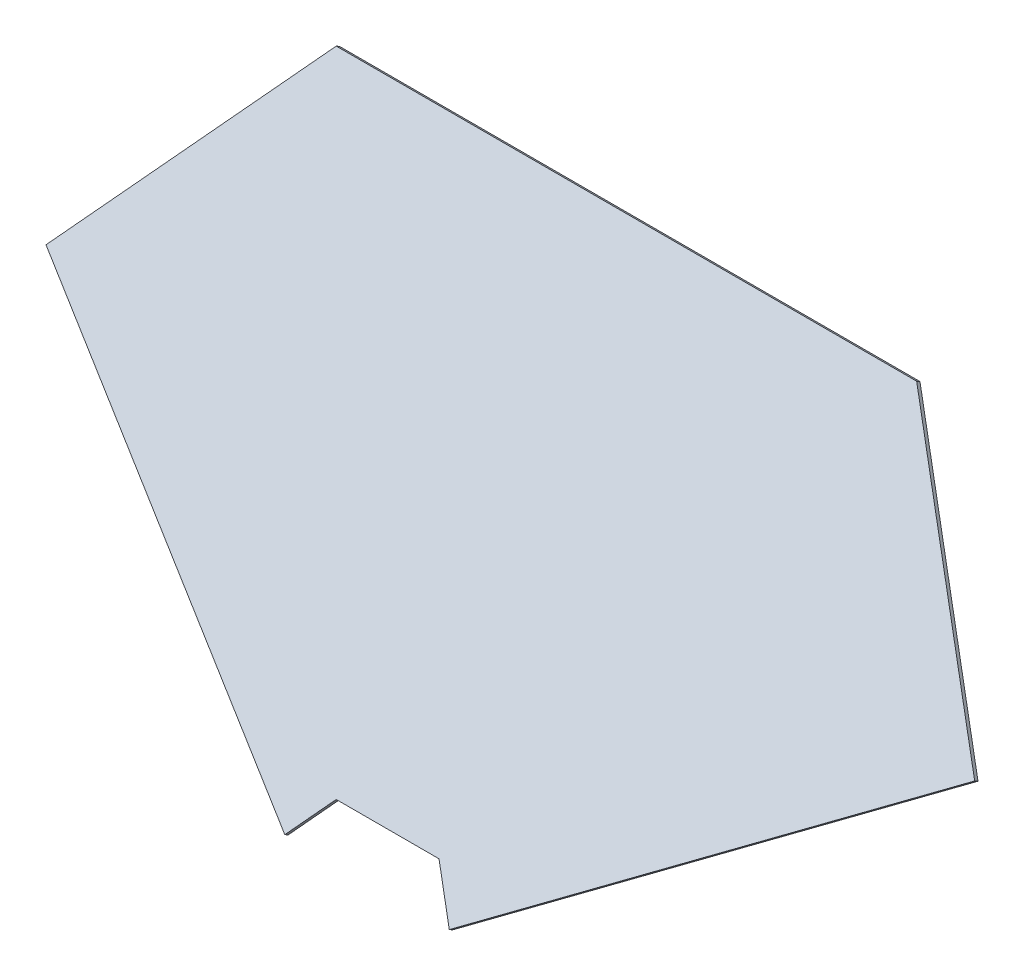
ISO-10303-21;
HEADER;
FILE_DESCRIPTION(('STEP AP214'),'2;1');
FILE_NAME('part.step','',(''),(''),'','','');
FILE_SCHEMA(('AUTOMOTIVE_DESIGN { 1 0 10303 214 1 1 1 1 }'));
ENDSEC;
DATA;
#1=APPLICATION_CONTEXT('core data for automotive mechanical design processes');
#2=APPLICATION_PROTOCOL_DEFINITION('international standard','automotive_design',2000,#1);
#3=PRODUCT_CONTEXT('',#1,'mechanical');
#4=PRODUCT('Part','Part','',(#3));
#5=PRODUCT_RELATED_PRODUCT_CATEGORY('part','',(#4));
#6=PRODUCT_DEFINITION_FORMATION('','',#4);
#7=PRODUCT_DEFINITION_CONTEXT('part definition',#1,'design');
#8=PRODUCT_DEFINITION('design','',#6,#7);
#9=PRODUCT_DEFINITION_SHAPE('','',#8);
#10=(LENGTH_UNIT() NAMED_UNIT(*) SI_UNIT(.MILLI.,.METRE.));
#11=(NAMED_UNIT(*) PLANE_ANGLE_UNIT() SI_UNIT($,.RADIAN.));
#12=(NAMED_UNIT(*) SI_UNIT($,.STERADIAN.) SOLID_ANGLE_UNIT());
#13=UNCERTAINTY_MEASURE_WITH_UNIT(LENGTH_MEASURE(1.E-05),#10,'distance_accuracy_value','');
#14=(GEOMETRIC_REPRESENTATION_CONTEXT(3) GLOBAL_UNCERTAINTY_ASSIGNED_CONTEXT((#13)) GLOBAL_UNIT_ASSIGNED_CONTEXT((#10,
#11,#12)) REPRESENTATION_CONTEXT('',''));
#15=CARTESIAN_POINT('',(0.,0.,0.));
#16=DIRECTION('',(0.,0.,1.));
#17=DIRECTION('',(1.,0.,0.));
#18=AXIS2_PLACEMENT_3D('',#15,#16,#17);
#19=CARTESIAN_POINT('',(0.,194.039063747176,261.06444587994));
#20=DIRECTION('',(0.,-0.866011828766892,0.500023511883015));
#21=DIRECTION('',(0.,-0.500023511883016,-0.866011828766892));
#22=AXIS2_PLACEMENT_3D('',#19,#20,#21);
#23=PLANE('',#22);
#24=DIRECTION('',(1.,0.,0.));
#25=VECTOR('',#24,1.);
#26=CARTESIAN_POINT('',(0.,-0.500023511883059,-75.8660118287669));
#27=LINE('',#26,#25);
#28=CARTESIAN_POINT('',(-74.9362095686931,-0.500023511882983,-75.8660118287669));
#29=VERTEX_POINT('',#28);
#30=CARTESIAN_POINT('',(74.9362095686931,-0.500023511883003,-75.8660118287669));
#31=VERTEX_POINT('',#30);
#32=EDGE_CURVE('E528',#29,#31,#27,.T.);
#33=ORIENTED_EDGE('',*,*,#32,.F.);
#34=DIRECTION('',(-0.99999999999944,-9.16231253504477E-07,5.29019528205087E-07));
#35=VECTOR('',#34,1.);
#36=CARTESIAN_POINT('',(-44.2687801150483,-0.499995413425658,-75.866028052436));
#37=LINE('',#36,#35);
#38=CARTESIAN_POINT('',(-75.3589070526765,-0.500023899171642,-75.8660116051517));
#39=VERTEX_POINT('',#38);
#40=EDGE_CURVE('E525',#39,#29,#37,.F.);
#41=ORIENTED_EDGE('',*,*,#40,.F.);
#42=DIRECTION('',(-3.35381304092173E-07,-0.500023899171702,-0.866011605151464));
#43=VECTOR('',#42,1.);
#44=CARTESIAN_POINT('',(-75.3589070526766,-0.500024017320216,-75.866011809778));
#45=LINE('',#44,#43);
#46=CARTESIAN_POINT('',(-75.3589067172952,1.45716771982052E-13,-75.0000000000001));
#47=VERTEX_POINT('',#46);
#48=EDGE_CURVE('E522',#47,#39,#45,.T.);
#49=ORIENTED_EDGE('',*,*,#48,.F.);
#50=DIRECTION('',(-0.99999999999944,-9.16231253504477E-07,5.29019528205087E-07));
#51=VECTOR('',#50,1.);
#52=CARTESIAN_POINT('',(-44.2687801150488,2.84857458177079E-05,-75.0000164472842));
#53=LINE('',#52,#51);
#54=CARTESIAN_POINT('',(-74.936209568693,0.,-75.));
#55=VERTEX_POINT('',#54);
#56=EDGE_CURVE('E535',#47,#55,#53,.F.);
#57=ORIENTED_EDGE('',*,*,#56,.T.);
#58=DIRECTION('',(-1.,0.,0.));
#59=VECTOR('',#58,1.);
#60=CARTESIAN_POINT('',(-75.,0.,-75.));
#61=LINE('',#60,#59);
#62=CARTESIAN_POINT('',(74.9362095686931,0.,-75.));
#63=VERTEX_POINT('',#62);
#64=EDGE_CURVE('E396',#63,#55,#61,.T.);
#65=ORIENTED_EDGE('',*,*,#64,.F.);
#66=DIRECTION('',(-0.99999999999944,9.16231431003959E-07,-5.29019630690886E-07));
#67=VECTOR('',#66,1.);
#68=CARTESIAN_POINT('',(44.2687801150611,2.80984628411862E-05,-75.0000162236722));
#69=LINE('',#68,#67);
#70=CARTESIAN_POINT('',(75.3589070526759,-3.87288645598005E-07,-74.9999997763847));
#71=VERTEX_POINT('',#70);
#72=EDGE_CURVE('E502',#63,#71,#69,.F.);
#73=ORIENTED_EDGE('',*,*,#72,.T.);
#74=DIRECTION('',(4.81754194128425E-13,-0.500023511883053,-0.86601182876687));
#75=VECTOR('',#74,1.);
#76=CARTESIAN_POINT('',(75.3589070526764,-0.500023899171601,-75.8660116051514));
#77=LINE('',#76,#75);
#78=CARTESIAN_POINT('',(75.3589070526764,-0.500023899171705,-75.8660116051516));
#79=VERTEX_POINT('',#78);
#80=EDGE_CURVE('E507',#71,#79,#77,.T.);
#81=ORIENTED_EDGE('',*,*,#80,.T.);
#82=DIRECTION('',(-0.99999999999944,9.16231431003959E-07,-5.29019630690886E-07));
#83=VECTOR('',#82,1.);
#84=CARTESIAN_POINT('',(44.2687801150611,-0.499995413420183,-75.8660280524391));
#85=LINE('',#84,#83);
#86=EDGE_CURVE('E558',#31,#79,#85,.F.);
#87=ORIENTED_EDGE('',*,*,#86,.F.);
#88=EDGE_LOOP('',(#33,#41,#49,#57,#65,#73,#81,#87));
#89=FACE_BOUND('',#88,.T.);
#90=ADVANCED_FACE('F387',(#89),#23,.F.);
#91=CARTESIAN_POINT('',(0.,86.6390872590587,323.07573907002));
#92=DIRECTION('',(0.,-0.866011828766892,0.500023511883015));
#93=DIRECTION('',(0.,-0.500023511883015,-0.866011828766892));
#94=AXIS2_PLACEMENT_3D('',#91,#92,#93);
#95=PLANE('',#94);
#96=DIRECTION('',(1.,0.,0.));
#97=VECTOR('',#96,1.);
#98=CARTESIAN_POINT('',(0.,-107.399976488117,-12.9887068099195));
#99=LINE('',#98,#97);
#100=CARTESIAN_POINT('',(-12.9249163786125,-107.399976488117,-12.9887068099195));
#101=VERTEX_POINT('',#100);
#102=CARTESIAN_POINT('',(12.9249163786124,-107.399976488117,-12.9887068099194));
#103=VERTEX_POINT('',#102);
#104=EDGE_CURVE('E12',#101,#103,#99,.T.);
#105=ORIENTED_EDGE('',*,*,#104,.F.);
#106=DIRECTION('',(0.99999999999944,9.16231219996015E-07,-5.29019508857755E-07));
#107=VECTOR('',#106,1.);
#108=CARTESIAN_POINT('',(-44.2686489065811,-107.400005206223,-12.9886902284735));
#109=LINE('',#108,#107);
#110=CARTESIAN_POINT('',(-13.3476138625957,-107.399976875406,-12.9887065863043));
#111=VERTEX_POINT('',#110);
#112=EDGE_CURVE('E513',#101,#111,#109,.F.);
#113=ORIENTED_EDGE('',*,*,#112,.T.);
#114=DIRECTION('',(-2.44172981295895E-13,-0.500023511883015,-0.866011828766892));
#115=VECTOR('',#114,1.);
#116=CARTESIAN_POINT('',(-13.347613862596,-107.900000387289,-13.8547184150711));
#117=LINE('',#116,#115);
#118=CARTESIAN_POINT('',(-13.347613862596,-107.900000387289,-13.8547184150711));
#119=VERTEX_POINT('',#118);
#120=EDGE_CURVE('E524',#111,#119,#117,.T.);
#121=ORIENTED_EDGE('',*,*,#120,.T.);
#122=DIRECTION('',(0.99999999999944,9.16231219996015E-07,-5.29019508857755E-07));
#123=VECTOR('',#122,1.);
#124=CARTESIAN_POINT('',(-44.2686489065811,-107.900028718106,-13.8547020572404));
#125=LINE('',#124,#123);
#126=CARTESIAN_POINT('',(-12.9249163786125,-107.9,-13.8547186386864));
#127=VERTEX_POINT('',#126);
#128=EDGE_CURVE('E537',#127,#119,#125,.F.);
#129=ORIENTED_EDGE('',*,*,#128,.F.);
#130=DIRECTION('',(-1.,0.,0.));
#131=VECTOR('',#130,1.);
#132=CARTESIAN_POINT('',(0.,-107.9,-13.8547186386864));
#133=LINE('',#132,#131);
#134=CARTESIAN_POINT('',(12.9249163786125,-107.9,-13.8547186386863));
#135=VERTEX_POINT('',#134);
#136=EDGE_CURVE('E527',#135,#127,#133,.T.);
#137=ORIENTED_EDGE('',*,*,#136,.F.);
#138=DIRECTION('',(0.99999999999944,-9.1623128523586E-07,5.29019546526359E-07));
#139=VECTOR('',#138,1.);
#140=CARTESIAN_POINT('',(44.2686489065765,-107.900028718108,-13.8547020572391));
#141=LINE('',#140,#139);
#142=CARTESIAN_POINT('',(13.3476138625959,-107.900000387289,-13.8547184150711));
#143=VERTEX_POINT('',#142);
#144=EDGE_CURVE('E486',#143,#135,#141,.F.);
#145=ORIENTED_EDGE('',*,*,#144,.F.);
#146=DIRECTION('',(3.35381359685026E-07,-0.500023899171834,-0.866011605151388));
#147=VECTOR('',#146,1.);
#148=CARTESIAN_POINT('',(13.3476138625959,-107.900000387289,-13.8547184150711));
#149=LINE('',#148,#147);
#150=CARTESIAN_POINT('',(13.3476135272145,-107.399976488117,-12.9887068099196));
#151=VERTEX_POINT('',#150);
#152=EDGE_CURVE('E481',#151,#143,#149,.T.);
#153=ORIENTED_EDGE('',*,*,#152,.F.);
#154=DIRECTION('',(0.99999999999944,-9.1623128523586E-07,5.29019546526359E-07));
#155=VECTOR('',#154,1.);
#156=CARTESIAN_POINT('',(44.268648906577,-107.400004818937,-12.9886904520875));
#157=LINE('',#156,#155);
#158=EDGE_CURVE('E556',#151,#103,#157,.F.);
#159=ORIENTED_EDGE('',*,*,#158,.T.);
#160=EDGE_LOOP('',(#105,#113,#121,#129,#137,#145,#153,#159));
#161=FACE_BOUND('',#160,.T.);
#162=ADVANCED_FACE('F570',(#161),#95,.T.);
#163=CARTESIAN_POINT('',(0.,-32.476970696419,-56.2482365673132));
#164=DIRECTION('',(0.,-0.500023511883015,-0.866011828766892));
#165=DIRECTION('',(0.,0.866011828766892,-0.500023511883015));
#166=AXIS2_PLACEMENT_3D('',#163,#164,#165);
#167=PLANE('',#166);
#168=ORIENTED_EDGE('',*,*,#64,.T.);
#169=ORIENTED_EDGE('',*,*,#56,.F.);
#170=DIRECTION('',(-0.599969904648345,-0.692829009445439,0.400030095351722));
#171=VECTOR('',#170,1.);
#172=CARTESIAN_POINT('',(-94.0120864782399,-21.5401871938187,-62.5629873755801));
#173=LINE('',#172,#171);
#174=CARTESIAN_POINT('',(-120.571982794867,-52.2108366938404,-44.8541693602756));
#175=VERTEX_POINT('',#174);
#176=EDGE_CURVE('E538',#175,#47,#173,.F.);
#177=ORIENTED_EDGE('',*,*,#176,.F.);
#178=DIRECTION('',(0.800022570629345,-0.519581034329518,0.29999905874633));
#179=VECTOR('',#178,1.);
#180=CARTESIAN_POINT('',(-120.571982794867,-52.2108366938404,-44.8541693602755));
#181=LINE('',#180,#179);
#182=CARTESIAN_POINT('',(-21.3557799424201,-116.647590346639,-7.64925969790897));
#183=VERTEX_POINT('',#182);
#184=EDGE_CURVE('E510',#175,#183,#181,.T.);
#185=ORIENTED_EDGE('',*,*,#184,.T.);
#186=DIRECTION('',(0.59996990464827,0.692829009445488,-0.400030095351751));
#187=VECTOR('',#186,1.);
#188=CARTESIAN_POINT('',(5.20411637420489,-85.9769408466275,-25.3580777132077));
#189=LINE('',#188,#187);
#190=EDGE_CURVE('E541',#111,#183,#189,.F.);
#191=ORIENTED_EDGE('',*,*,#190,.F.);
#192=ORIENTED_EDGE('',*,*,#112,.F.);
#193=ORIENTED_EDGE('',*,*,#104,.T.);
#194=ORIENTED_EDGE('',*,*,#158,.F.);
#195=DIRECTION('',(0.599969904648191,-0.692829009445539,0.40003009535178));
#196=VECTOR('',#195,1.);
#197=CARTESIAN_POINT('',(-5.20411637420628,-85.9769408466218,-25.358077713211));
#198=LINE('',#197,#196);
#199=CARTESIAN_POINT('',(21.3557799424199,-116.647590346639,-7.64925969790907));
#200=VERTEX_POINT('',#199);
#201=EDGE_CURVE('E559',#200,#151,#198,.F.);
#202=ORIENTED_EDGE('',*,*,#201,.F.);
#203=DIRECTION('',(-0.800022570629345,-0.519581034329518,0.29999905874633));
#204=VECTOR('',#203,1.);
#205=CARTESIAN_POINT('',(120.571982794867,-52.2108366938405,-44.8541693602756));
#206=LINE('',#205,#204);
#207=CARTESIAN_POINT('',(120.571982794867,-52.2108366938406,-44.8541693602757));
#208=VERTEX_POINT('',#207);
#209=EDGE_CURVE('E495',#208,#200,#206,.T.);
#210=ORIENTED_EDGE('',*,*,#209,.F.);
#211=DIRECTION('',(-0.599969904648406,0.692829009445399,-0.400030095351699));
#212=VECTOR('',#211,1.);
#213=CARTESIAN_POINT('',(94.0120864782388,-21.5401871938142,-62.5629873755827));
#214=LINE('',#213,#212);
#215=EDGE_CURVE('E561',#71,#208,#214,.F.);
#216=ORIENTED_EDGE('',*,*,#215,.F.);
#217=ORIENTED_EDGE('',*,*,#72,.F.);
#218=EDGE_LOOP('',(#168,#169,#177,#185,#191,#192,#193,#194,#202,#210,#216,#217));
#219=FACE_BOUND('',#218,.T.);
#220=ADVANCED_FACE('F568',(#219),#167,.F.);
#221=CARTESIAN_POINT('',(0.,-32.976994208302,-57.1142483960801));
#222=DIRECTION('',(0.,-0.500023511883015,-0.866011828766892));
#223=DIRECTION('',(0.,0.866011828766892,-0.500023511883015));
#224=AXIS2_PLACEMENT_3D('',#221,#222,#223);
#225=PLANE('',#224);
#226=ORIENTED_EDGE('',*,*,#136,.T.);
#227=ORIENTED_EDGE('',*,*,#128,.T.);
#228=DIRECTION('',(0.59996990464827,0.692829009445488,-0.400030095351751));
#229=VECTOR('',#228,1.);
#230=CARTESIAN_POINT('',(5.20411637420473,-86.4769643585104,-26.2240895419746));
#231=LINE('',#230,#229);
#232=CARTESIAN_POINT('',(-21.3557799424201,-117.147613858522,-8.5152715266759));
#233=VERTEX_POINT('',#232);
#234=EDGE_CURVE('E544',#119,#233,#231,.F.);
#235=ORIENTED_EDGE('',*,*,#234,.T.);
#236=DIRECTION('',(0.800022570629345,-0.519581034329518,0.29999905874633));
#237=VECTOR('',#236,1.);
#238=CARTESIAN_POINT('',(-90.5697256434849,-72.1960652177176,-34.469687470347));
#239=LINE('',#238,#237);
#240=CARTESIAN_POINT('',(-120.571982794867,-52.7108602057234,-45.7201811890424));
#241=VERTEX_POINT('',#240);
#242=EDGE_CURVE('E509',#241,#233,#239,.T.);
#243=ORIENTED_EDGE('',*,*,#242,.F.);
#244=DIRECTION('',(-0.599969904648345,-0.692829009445439,0.400030095351722));
#245=VECTOR('',#244,1.);
#246=CARTESIAN_POINT('',(-94.0120864782402,-22.0402107057016,-63.4289992043471));
#247=LINE('',#246,#245);
#248=EDGE_CURVE('E534',#241,#39,#247,.F.);
#249=ORIENTED_EDGE('',*,*,#248,.T.);
#250=ORIENTED_EDGE('',*,*,#40,.T.);
#251=ORIENTED_EDGE('',*,*,#32,.T.);
#252=ORIENTED_EDGE('',*,*,#86,.T.);
#253=DIRECTION('',(-0.599969904648406,0.692829009445399,-0.400030095351699));
#254=VECTOR('',#253,1.);
#255=CARTESIAN_POINT('',(94.0120864782391,-22.0402107056971,-63.4289992043497));
#256=LINE('',#255,#254);
#257=CARTESIAN_POINT('',(120.571982794867,-52.7108602057235,-45.7201811890425));
#258=VERTEX_POINT('',#257);
#259=EDGE_CURVE('E487',#79,#258,#256,.F.);
#260=ORIENTED_EDGE('',*,*,#259,.T.);
#261=DIRECTION('',(-0.800022570629345,-0.519581034329518,0.29999905874633));
#262=VECTOR('',#261,1.);
#263=CARTESIAN_POINT('',(90.5697256434848,-72.1960652177176,-34.4696874703471));
#264=LINE('',#263,#262);
#265=CARTESIAN_POINT('',(21.35577994242,-117.147613858522,-8.51527152667601));
#266=VERTEX_POINT('',#265);
#267=EDGE_CURVE('E493',#258,#266,#264,.T.);
#268=ORIENTED_EDGE('',*,*,#267,.T.);
#269=DIRECTION('',(0.599969904648191,-0.692829009445539,0.40003009535178));
#270=VECTOR('',#269,1.);
#271=CARTESIAN_POINT('',(-5.20411637420605,-86.4769643585046,-26.2240895419779));
#272=LINE('',#271,#270);
#273=EDGE_CURVE('E391',#266,#143,#272,.F.);
#274=ORIENTED_EDGE('',*,*,#273,.T.);
#275=ORIENTED_EDGE('',*,*,#144,.T.);
#276=EDGE_LOOP('',(#226,#227,#235,#243,#249,#250,#251,#252,#260,#268,#274,#275));
#277=FACE_BOUND('',#276,.T.);
#278=ADVANCED_FACE('F389',(#277),#225,.T.);
#279=CARTESIAN_POINT('',(-13.347613862596,-107.900000387289,-13.8547184150711));
#280=DIRECTION('',(-0.800022570629321,0.519581034329643,-0.299999058746176));
#281=DIRECTION('',(-0.54466875072375,-0.838651269590066,0.));
#282=AXIS2_PLACEMENT_3D('',#279,#280,#281);
#283=PLANE('',#282);
#284=ORIENTED_EDGE('',*,*,#120,.F.);
#285=ORIENTED_EDGE('',*,*,#190,.T.);
#286=DIRECTION('',(0.,-0.500023511883015,-0.866011828766892));
#287=VECTOR('',#286,1.);
#288=CARTESIAN_POINT('',(-21.3557799424201,54.6002134155969,288.942040879061));
#289=LINE('',#288,#287);
#290=EDGE_CURVE('E514',#183,#233,#289,.T.);
#291=ORIENTED_EDGE('',*,*,#290,.T.);
#292=ORIENTED_EDGE('',*,*,#234,.F.);
#293=EDGE_LOOP('',(#284,#285,#291,#292));
#294=FACE_BOUND('',#293,.T.);
#295=ADVANCED_FACE('F575',(#294),#283,.F.);
#296=CARTESIAN_POINT('',(-75.612512285238,-0.792880358644797,-75.6969202481065));
#297=DIRECTION('',(0.800022570629264,-0.519581034329781,0.29999905874609));
#298=DIRECTION('',(0.544668750723878,0.838651269589983,0.));
#299=AXIS2_PLACEMENT_3D('',#296,#297,#298);
#300=PLANE('',#299);
#301=ORIENTED_EDGE('',*,*,#248,.F.);
#302=DIRECTION('',(0.,-0.500023511883015,-0.866011828766892));
#303=VECTOR('',#302,1.);
#304=CARTESIAN_POINT('',(-120.571982794867,119.036967068395,251.737131216695));
#305=LINE('',#304,#303);
#306=EDGE_CURVE('E517',#175,#241,#305,.T.);
#307=ORIENTED_EDGE('',*,*,#306,.F.);
#308=ORIENTED_EDGE('',*,*,#176,.T.);
#309=ORIENTED_EDGE('',*,*,#48,.T.);
#310=EDGE_LOOP('',(#301,#307,#308,#309));
#311=FACE_BOUND('',#310,.T.);
#312=ADVANCED_FACE('F583',(#311),#300,.F.);
#313=CARTESIAN_POINT('',(-120.571982794867,119.036967068395,251.737131216695));
#314=DIRECTION('',(0.599969904648237,0.692829009445509,-0.400030095351763));
#315=DIRECTION('',(-0.755949257762085,0.654630215991404,0.));
#316=AXIS2_PLACEMENT_3D('',#313,#314,#315);
#317=PLANE('',#316);
#318=ORIENTED_EDGE('',*,*,#242,.T.);
#319=ORIENTED_EDGE('',*,*,#290,.F.);
#320=ORIENTED_EDGE('',*,*,#184,.F.);
#321=ORIENTED_EDGE('',*,*,#306,.T.);
#322=EDGE_LOOP('',(#318,#319,#320,#321));
#323=FACE_BOUND('',#322,.T.);
#324=ADVANCED_FACE('F581',(#323),#317,.F.);
#325=CARTESIAN_POINT('',(75.3589070526764,-0.500023899171705,-75.8660116051516));
#326=DIRECTION('',(-0.800022570629218,-0.519581034329844,0.299999058746103));
#327=DIRECTION('',(0.544668750723946,-0.838651269589938,0.));
#328=AXIS2_PLACEMENT_3D('',#325,#326,#327);
#329=PLANE('',#328);
#330=ORIENTED_EDGE('',*,*,#80,.F.);
#331=ORIENTED_EDGE('',*,*,#215,.T.);
#332=DIRECTION('',(0.,-0.500023511883015,-0.866011828766892));
#333=VECTOR('',#332,1.);
#334=CARTESIAN_POINT('',(120.571982794867,119.036967068395,251.737131216695));
#335=LINE('',#334,#333);
#336=EDGE_CURVE('E500',#208,#258,#335,.T.);
#337=ORIENTED_EDGE('',*,*,#336,.T.);
#338=ORIENTED_EDGE('',*,*,#259,.F.);
#339=EDGE_LOOP('',(#330,#331,#337,#338));
#340=FACE_BOUND('',#339,.T.);
#341=ADVANCED_FACE('F588',(#340),#329,.F.);
#342=CARTESIAN_POINT('',(13.6012190951574,-108.192856846762,-13.6856270580258));
#343=DIRECTION('',(0.80002257062938,0.519581034329623,-0.299999058746053));
#344=DIRECTION('',(-0.544668750723707,0.838651269590094,0.));
#345=AXIS2_PLACEMENT_3D('',#342,#343,#344);
#346=PLANE('',#345);
#347=ORIENTED_EDGE('',*,*,#273,.F.);
#348=DIRECTION('',(0.,-0.500023511883015,-0.866011828766892));
#349=VECTOR('',#348,1.);
#350=CARTESIAN_POINT('',(21.35577994242,54.6002134155968,288.942040879061));
#351=LINE('',#350,#349);
#352=EDGE_CURVE('E480',#200,#266,#351,.T.);
#353=ORIENTED_EDGE('',*,*,#352,.F.);
#354=ORIENTED_EDGE('',*,*,#201,.T.);
#355=ORIENTED_EDGE('',*,*,#152,.T.);
#356=EDGE_LOOP('',(#347,#353,#354,#355));
#357=FACE_BOUND('',#356,.T.);
#358=ADVANCED_FACE('F478',(#357),#346,.F.);
#359=CARTESIAN_POINT('',(120.571982794867,119.036967068395,251.737131216695));
#360=DIRECTION('',(0.599969904648237,-0.692829009445509,0.400030095351763));
#361=DIRECTION('',(0.755949257762085,0.654630215991404,0.));
#362=AXIS2_PLACEMENT_3D('',#359,#360,#361);
#363=PLANE('',#362);
#364=ORIENTED_EDGE('',*,*,#352,.T.);
#365=ORIENTED_EDGE('',*,*,#267,.F.);
#366=ORIENTED_EDGE('',*,*,#336,.F.);
#367=ORIENTED_EDGE('',*,*,#209,.T.);
#368=EDGE_LOOP('',(#364,#365,#366,#367));
#369=FACE_BOUND('',#368,.T.);
#370=ADVANCED_FACE('F491',(#369),#363,.T.);
#371=CLOSED_SHELL('',(#90,#162,#220,#278,#295,#312,#324,#341,#358,#370));
#372=MANIFOLD_SOLID_BREP('B2',#371);
#373=ADVANCED_BREP_SHAPE_REPRESENTATION('',(#18,#372),#14);
#374=SHAPE_DEFINITION_REPRESENTATION(#9,#373);
ENDSEC;
END-ISO-10303-21;
